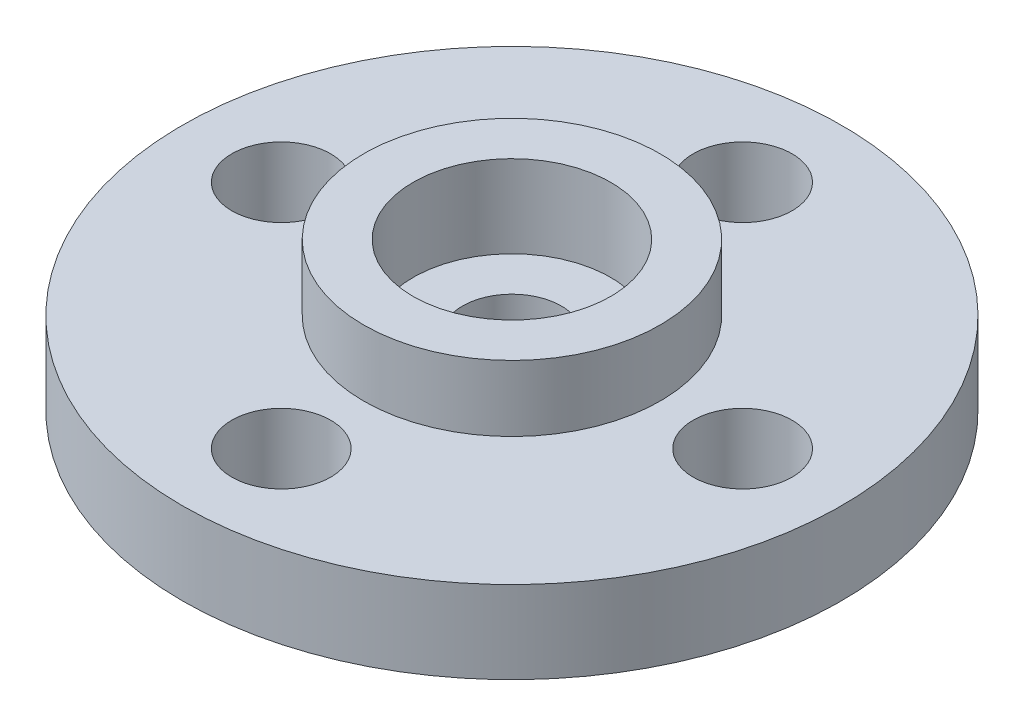
ISO-10303-21;
HEADER;
FILE_DESCRIPTION(('STEP AP214'),'2;1');
FILE_NAME('part.step','',(''),(''),'','','');
FILE_SCHEMA(('AUTOMOTIVE_DESIGN { 1 0 10303 214 1 1 1 1 }'));
ENDSEC;
DATA;
#1=APPLICATION_CONTEXT('core data for automotive mechanical design processes');
#2=APPLICATION_PROTOCOL_DEFINITION('international standard','automotive_design',2000,#1);
#3=PRODUCT_CONTEXT('',#1,'mechanical');
#4=PRODUCT('Part','Part','',(#3));
#5=PRODUCT_RELATED_PRODUCT_CATEGORY('part','',(#4));
#6=PRODUCT_DEFINITION_FORMATION('','',#4);
#7=PRODUCT_DEFINITION_CONTEXT('part definition',#1,'design');
#8=PRODUCT_DEFINITION('design','',#6,#7);
#9=PRODUCT_DEFINITION_SHAPE('','',#8);
#10=(LENGTH_UNIT() NAMED_UNIT(*) SI_UNIT(.MILLI.,.METRE.));
#11=(NAMED_UNIT(*) PLANE_ANGLE_UNIT() SI_UNIT($,.RADIAN.));
#12=(NAMED_UNIT(*) SI_UNIT($,.STERADIAN.) SOLID_ANGLE_UNIT());
#13=UNCERTAINTY_MEASURE_WITH_UNIT(LENGTH_MEASURE(1.E-05),#10,'distance_accuracy_value','');
#14=(GEOMETRIC_REPRESENTATION_CONTEXT(3) GLOBAL_UNCERTAINTY_ASSIGNED_CONTEXT((#13)) GLOBAL_UNIT_ASSIGNED_CONTEXT((#10,
#11,#12)) REPRESENTATION_CONTEXT('',''));
#15=CARTESIAN_POINT('',(0.,0.,0.));
#16=DIRECTION('',(0.,0.,1.));
#17=DIRECTION('',(1.,0.,0.));
#18=AXIS2_PLACEMENT_3D('',#15,#16,#17);
#19=CARTESIAN_POINT('',(0.,2.5,0.));
#20=DIRECTION('',(0.,-1.,0.));
#21=DIRECTION('',(0.,0.,-1.));
#22=AXIS2_PLACEMENT_3D('',#19,#20,#21);
#23=CYLINDRICAL_SURFACE('',#22,1.5);
#24=CARTESIAN_POINT('',(0.,0.,0.));
#25=DIRECTION('',(0.,1.,0.));
#26=DIRECTION('',(0.,0.,1.));
#27=AXIS2_PLACEMENT_3D('',#24,#25,#26);
#28=CIRCLE('',#27,1.5);
#29=CARTESIAN_POINT('',(0.,0.,1.5));
#30=VERTEX_POINT('',#29);
#31=EDGE_CURVE('E46',#30,#30,#28,.T.);
#32=ORIENTED_EDGE('',*,*,#31,.F.);
#33=EDGE_LOOP('',(#32));
#34=FACE_BOUND('',#33,.T.);
#35=CARTESIAN_POINT('',(0.,2.,0.));
#36=DIRECTION('',(0.,1.,0.));
#37=DIRECTION('',(0.,0.,1.));
#38=AXIS2_PLACEMENT_3D('',#35,#36,#37);
#39=CIRCLE('',#38,1.5);
#40=CARTESIAN_POINT('',(0.,2.,1.5));
#41=VERTEX_POINT('',#40);
#42=EDGE_CURVE('E37',#41,#41,#39,.T.);
#43=ORIENTED_EDGE('',*,*,#42,.T.);
#44=EDGE_LOOP('',(#43));
#45=FACE_BOUND('',#44,.T.);
#46=ADVANCED_FACE('F33',(#34,#45),#23,.F.);
#47=CARTESIAN_POINT('',(0.,2.5,0.));
#48=DIRECTION('',(0.,1.,0.));
#49=DIRECTION('',(0.,0.,1.));
#50=AXIS2_PLACEMENT_3D('',#47,#48,#49);
#51=PLANE('',#50);
#52=CARTESIAN_POINT('',(0.,2.5,0.));
#53=DIRECTION('',(0.,1.,0.));
#54=DIRECTION('',(0.,0.,1.));
#55=AXIS2_PLACEMENT_3D('',#52,#53,#54);
#56=CIRCLE('',#55,4.5);
#57=CARTESIAN_POINT('',(0.,2.5,4.5));
#58=VERTEX_POINT('',#57);
#59=EDGE_CURVE('E75',#58,#58,#56,.T.);
#60=ORIENTED_EDGE('',*,*,#59,.F.);
#61=EDGE_LOOP('',(#60));
#62=FACE_BOUND('',#61,.T.);
#63=CARTESIAN_POINT('',(3.96422056675552E-13,2.5,7.));
#64=DIRECTION('',(0.,1.,0.));
#65=DIRECTION('',(0.,0.,1.));
#66=AXIS2_PLACEMENT_3D('',#63,#64,#65);
#67=CIRCLE('',#66,1.50000000000043);
#68=CARTESIAN_POINT('',(3.96422056675552E-13,2.5,8.50000000000043));
#69=VERTEX_POINT('',#68);
#70=EDGE_CURVE('E60',#69,#69,#67,.T.);
#71=ORIENTED_EDGE('',*,*,#70,.F.);
#72=EDGE_LOOP('',(#71));
#73=FACE_BOUND('',#72,.T.);
#74=CARTESIAN_POINT('',(0.,2.5,-7.));
#75=DIRECTION('',(0.,1.,0.));
#76=DIRECTION('',(0.,0.,1.));
#77=AXIS2_PLACEMENT_3D('',#74,#75,#76);
#78=CIRCLE('',#77,1.5);
#79=CARTESIAN_POINT('',(0.,2.5,-5.5));
#80=VERTEX_POINT('',#79);
#81=EDGE_CURVE('E50',#80,#80,#78,.T.);
#82=ORIENTED_EDGE('',*,*,#81,.F.);
#83=EDGE_LOOP('',(#82));
#84=FACE_BOUND('',#83,.T.);
#85=CARTESIAN_POINT('',(0.,2.5,0.));
#86=DIRECTION('',(0.,1.,0.));
#87=DIRECTION('',(0.,0.,1.));
#88=AXIS2_PLACEMENT_3D('',#85,#86,#87);
#89=CIRCLE('',#88,10.);
#90=CARTESIAN_POINT('',(0.,2.5,10.));
#91=VERTEX_POINT('',#90);
#92=EDGE_CURVE('E10',#91,#91,#89,.T.);
#93=ORIENTED_EDGE('',*,*,#92,.T.);
#94=EDGE_LOOP('',(#93));
#95=FACE_BOUND('',#94,.T.);
#96=CARTESIAN_POINT('',(7.,2.5,0.));
#97=DIRECTION('',(0.,1.,0.));
#98=DIRECTION('',(0.,0.,1.));
#99=AXIS2_PLACEMENT_3D('',#96,#97,#98);
#100=CIRCLE('',#99,1.5);
#101=CARTESIAN_POINT('',(7.,2.5,1.50000000000003));
#102=VERTEX_POINT('',#101);
#103=EDGE_CURVE('E54',#102,#102,#100,.T.);
#104=ORIENTED_EDGE('',*,*,#103,.F.);
#105=EDGE_LOOP('',(#104));
#106=FACE_BOUND('',#105,.T.);
#107=CARTESIAN_POINT('',(-6.9999999999998,2.5,1.98523339633126E-13));
#108=DIRECTION('',(0.,1.,0.));
#109=DIRECTION('',(0.,0.,1.));
#110=AXIS2_PLACEMENT_3D('',#107,#108,#109);
#111=CIRCLE('',#110,1.50000000000032);
#112=CARTESIAN_POINT('',(-6.9999999999998,2.5,1.50000000000052));
#113=VERTEX_POINT('',#112);
#114=EDGE_CURVE('E66',#113,#113,#111,.T.);
#115=ORIENTED_EDGE('',*,*,#114,.F.);
#116=EDGE_LOOP('',(#115));
#117=FACE_BOUND('',#116,.T.);
#118=ADVANCED_FACE('F102',(#62,#73,#84,#95,#106,#117),#51,.T.);
#119=CARTESIAN_POINT('',(0.,0.,0.));
#120=DIRECTION('',(0.,1.,0.));
#121=DIRECTION('',(0.,0.,1.));
#122=AXIS2_PLACEMENT_3D('',#119,#120,#121);
#123=PLANE('',#122);
#124=CARTESIAN_POINT('',(0.,0.,0.));
#125=DIRECTION('',(0.,1.,0.));
#126=DIRECTION('',(0.,0.,1.));
#127=AXIS2_PLACEMENT_3D('',#124,#125,#126);
#128=CIRCLE('',#127,10.);
#129=CARTESIAN_POINT('',(0.,0.,10.));
#130=VERTEX_POINT('',#129);
#131=EDGE_CURVE('E41',#130,#130,#128,.T.);
#132=ORIENTED_EDGE('',*,*,#131,.F.);
#133=EDGE_LOOP('',(#132));
#134=FACE_BOUND('',#133,.T.);
#135=ORIENTED_EDGE('',*,*,#31,.T.);
#136=EDGE_LOOP('',(#135));
#137=FACE_BOUND('',#136,.T.);
#138=CARTESIAN_POINT('',(0.,0.,-7.));
#139=DIRECTION('',(0.,1.,0.));
#140=DIRECTION('',(0.,0.,1.));
#141=AXIS2_PLACEMENT_3D('',#138,#139,#140);
#142=CIRCLE('',#141,1.5);
#143=CARTESIAN_POINT('',(0.,0.,-5.5));
#144=VERTEX_POINT('',#143);
#145=EDGE_CURVE('E51',#144,#144,#142,.T.);
#146=ORIENTED_EDGE('',*,*,#145,.T.);
#147=EDGE_LOOP('',(#146));
#148=FACE_BOUND('',#147,.T.);
#149=CARTESIAN_POINT('',(7.,0.,0.));
#150=DIRECTION('',(0.,1.,0.));
#151=DIRECTION('',(0.,0.,1.));
#152=AXIS2_PLACEMENT_3D('',#149,#150,#151);
#153=CIRCLE('',#152,1.5);
#154=CARTESIAN_POINT('',(7.,0.,1.50000000000003));
#155=VERTEX_POINT('',#154);
#156=EDGE_CURVE('E57',#155,#155,#153,.T.);
#157=ORIENTED_EDGE('',*,*,#156,.T.);
#158=EDGE_LOOP('',(#157));
#159=FACE_BOUND('',#158,.T.);
#160=CARTESIAN_POINT('',(3.96422056675552E-13,0.,7.));
#161=DIRECTION('',(0.,1.,0.));
#162=DIRECTION('',(0.,0.,1.));
#163=AXIS2_PLACEMENT_3D('',#160,#161,#162);
#164=CIRCLE('',#163,1.50000000000043);
#165=CARTESIAN_POINT('',(3.96422056675552E-13,0.,8.50000000000043));
#166=VERTEX_POINT('',#165);
#167=EDGE_CURVE('E63',#166,#166,#164,.T.);
#168=ORIENTED_EDGE('',*,*,#167,.T.);
#169=EDGE_LOOP('',(#168));
#170=FACE_BOUND('',#169,.T.);
#171=CARTESIAN_POINT('',(-6.9999999999998,0.,1.98523339633126E-13));
#172=DIRECTION('',(0.,1.,0.));
#173=DIRECTION('',(0.,0.,1.));
#174=AXIS2_PLACEMENT_3D('',#171,#172,#173);
#175=CIRCLE('',#174,1.50000000000032);
#176=CARTESIAN_POINT('',(-6.9999999999998,0.,1.50000000000052));
#177=VERTEX_POINT('',#176);
#178=EDGE_CURVE('E69',#177,#177,#175,.T.);
#179=ORIENTED_EDGE('',*,*,#178,.T.);
#180=EDGE_LOOP('',(#179));
#181=FACE_BOUND('',#180,.T.);
#182=ADVANCED_FACE('F108',(#134,#137,#148,#159,#170,#181),#123,.F.);
#183=CARTESIAN_POINT('',(0.,2.5,0.));
#184=DIRECTION('',(0.,-1.,0.));
#185=DIRECTION('',(0.,0.,-1.));
#186=AXIS2_PLACEMENT_3D('',#183,#184,#185);
#187=CYLINDRICAL_SURFACE('',#186,10.);
#188=ORIENTED_EDGE('',*,*,#92,.F.);
#189=EDGE_LOOP('',(#188));
#190=FACE_BOUND('',#189,.T.);
#191=ORIENTED_EDGE('',*,*,#131,.T.);
#192=EDGE_LOOP('',(#191));
#193=FACE_BOUND('',#192,.T.);
#194=ADVANCED_FACE('F35',(#190,#193),#187,.T.);
#195=CARTESIAN_POINT('',(0.,2.5,-7.));
#196=DIRECTION('',(0.,-1.,0.));
#197=DIRECTION('',(0.,0.,-1.));
#198=AXIS2_PLACEMENT_3D('',#195,#196,#197);
#199=CYLINDRICAL_SURFACE('',#198,1.5);
#200=ORIENTED_EDGE('',*,*,#81,.T.);
#201=EDGE_LOOP('',(#200));
#202=FACE_BOUND('',#201,.T.);
#203=ORIENTED_EDGE('',*,*,#145,.F.);
#204=EDGE_LOOP('',(#203));
#205=FACE_BOUND('',#204,.T.);
#206=ADVANCED_FACE('F113',(#202,#205),#199,.F.);
#207=CARTESIAN_POINT('',(7.,2.5,0.));
#208=DIRECTION('',(0.,-1.,0.));
#209=DIRECTION('',(0.,0.,-1.));
#210=AXIS2_PLACEMENT_3D('',#207,#208,#209);
#211=CYLINDRICAL_SURFACE('',#210,1.5);
#212=ORIENTED_EDGE('',*,*,#103,.T.);
#213=EDGE_LOOP('',(#212));
#214=FACE_BOUND('',#213,.T.);
#215=ORIENTED_EDGE('',*,*,#156,.F.);
#216=EDGE_LOOP('',(#215));
#217=FACE_BOUND('',#216,.T.);
#218=ADVANCED_FACE('F144',(#214,#217),#211,.F.);
#219=CARTESIAN_POINT('',(3.96422056675552E-13,2.5,7.));
#220=DIRECTION('',(0.,-1.,0.));
#221=DIRECTION('',(0.,0.,-1.));
#222=AXIS2_PLACEMENT_3D('',#219,#220,#221);
#223=CYLINDRICAL_SURFACE('',#222,1.50000000000043);
#224=ORIENTED_EDGE('',*,*,#70,.T.);
#225=EDGE_LOOP('',(#224));
#226=FACE_BOUND('',#225,.T.);
#227=ORIENTED_EDGE('',*,*,#167,.F.);
#228=EDGE_LOOP('',(#227));
#229=FACE_BOUND('',#228,.T.);
#230=ADVANCED_FACE('F135',(#226,#229),#223,.F.);
#231=CARTESIAN_POINT('',(-6.9999999999998,2.5,1.98523339633126E-13));
#232=DIRECTION('',(0.,-1.,0.));
#233=DIRECTION('',(0.,0.,-1.));
#234=AXIS2_PLACEMENT_3D('',#231,#232,#233);
#235=CYLINDRICAL_SURFACE('',#234,1.50000000000032);
#236=ORIENTED_EDGE('',*,*,#114,.T.);
#237=EDGE_LOOP('',(#236));
#238=FACE_BOUND('',#237,.T.);
#239=ORIENTED_EDGE('',*,*,#178,.F.);
#240=EDGE_LOOP('',(#239));
#241=FACE_BOUND('',#240,.T.);
#242=ADVANCED_FACE('F132',(#238,#241),#235,.F.);
#243=CARTESIAN_POINT('',(0.,4.5,0.));
#244=DIRECTION('',(0.,1.,0.));
#245=DIRECTION('',(0.,0.,1.));
#246=AXIS2_PLACEMENT_3D('',#243,#244,#245);
#247=PLANE('',#246);
#248=CARTESIAN_POINT('',(0.,4.5,0.));
#249=DIRECTION('',(0.,1.,0.));
#250=DIRECTION('',(0.,0.,1.));
#251=AXIS2_PLACEMENT_3D('',#248,#249,#250);
#252=CIRCLE('',#251,4.5);
#253=CARTESIAN_POINT('',(0.,4.5,4.5));
#254=VERTEX_POINT('',#253);
#255=EDGE_CURVE('E72',#254,#254,#252,.T.);
#256=ORIENTED_EDGE('',*,*,#255,.T.);
#257=EDGE_LOOP('',(#256));
#258=FACE_BOUND('',#257,.T.);
#259=CARTESIAN_POINT('',(0.,4.5,0.));
#260=DIRECTION('',(0.,1.,0.));
#261=DIRECTION('',(0.,0.,1.));
#262=AXIS2_PLACEMENT_3D('',#259,#260,#261);
#263=CIRCLE('',#262,3.);
#264=CARTESIAN_POINT('',(0.,4.5,3.));
#265=VERTEX_POINT('',#264);
#266=EDGE_CURVE('E78',#265,#265,#263,.T.);
#267=ORIENTED_EDGE('',*,*,#266,.F.);
#268=EDGE_LOOP('',(#267));
#269=FACE_BOUND('',#268,.T.);
#270=ADVANCED_FACE('F134',(#258,#269),#247,.T.);
#271=CARTESIAN_POINT('',(0.,4.5,0.));
#272=DIRECTION('',(0.,-1.,0.));
#273=DIRECTION('',(0.,0.,-1.));
#274=AXIS2_PLACEMENT_3D('',#271,#272,#273);
#275=CYLINDRICAL_SURFACE('',#274,4.5);
#276=ORIENTED_EDGE('',*,*,#255,.F.);
#277=EDGE_LOOP('',(#276));
#278=FACE_BOUND('',#277,.T.);
#279=ORIENTED_EDGE('',*,*,#59,.T.);
#280=EDGE_LOOP('',(#279));
#281=FACE_BOUND('',#280,.T.);
#282=ADVANCED_FACE('F98',(#278,#281),#275,.T.);
#283=CARTESIAN_POINT('',(0.,4.5,0.));
#284=DIRECTION('',(0.,-1.,0.));
#285=DIRECTION('',(0.,0.,-1.));
#286=AXIS2_PLACEMENT_3D('',#283,#284,#285);
#287=CYLINDRICAL_SURFACE('',#286,3.);
#288=ORIENTED_EDGE('',*,*,#266,.T.);
#289=EDGE_LOOP('',(#288));
#290=FACE_BOUND('',#289,.T.);
#291=CARTESIAN_POINT('',(0.,2.,0.));
#292=DIRECTION('',(0.,1.,0.));
#293=DIRECTION('',(0.,0.,1.));
#294=AXIS2_PLACEMENT_3D('',#291,#292,#293);
#295=CIRCLE('',#294,3.);
#296=CARTESIAN_POINT('',(0.,2.,3.));
#297=VERTEX_POINT('',#296);
#298=EDGE_CURVE('E83',#297,#297,#295,.T.);
#299=ORIENTED_EDGE('',*,*,#298,.F.);
#300=EDGE_LOOP('',(#299));
#301=FACE_BOUND('',#300,.T.);
#302=ADVANCED_FACE('F93',(#290,#301),#287,.F.);
#303=CARTESIAN_POINT('',(0.,2.,0.));
#304=DIRECTION('',(0.,1.,0.));
#305=DIRECTION('',(0.,0.,1.));
#306=AXIS2_PLACEMENT_3D('',#303,#304,#305);
#307=PLANE('',#306);
#308=ORIENTED_EDGE('',*,*,#42,.F.);
#309=EDGE_LOOP('',(#308));
#310=FACE_BOUND('',#309,.T.);
#311=ORIENTED_EDGE('',*,*,#298,.T.);
#312=EDGE_LOOP('',(#311));
#313=FACE_BOUND('',#312,.T.);
#314=ADVANCED_FACE('F91',(#310,#313),#307,.T.);
#315=CLOSED_SHELL('',(#46,#118,#182,#194,#206,#218,#230,#242,#270,#282,#302,#314));
#316=MANIFOLD_SOLID_BREP('B2',#315);
#317=ADVANCED_BREP_SHAPE_REPRESENTATION('',(#18,#316),#14);
#318=SHAPE_DEFINITION_REPRESENTATION(#9,#317);
ENDSEC;
END-ISO-10303-21;
